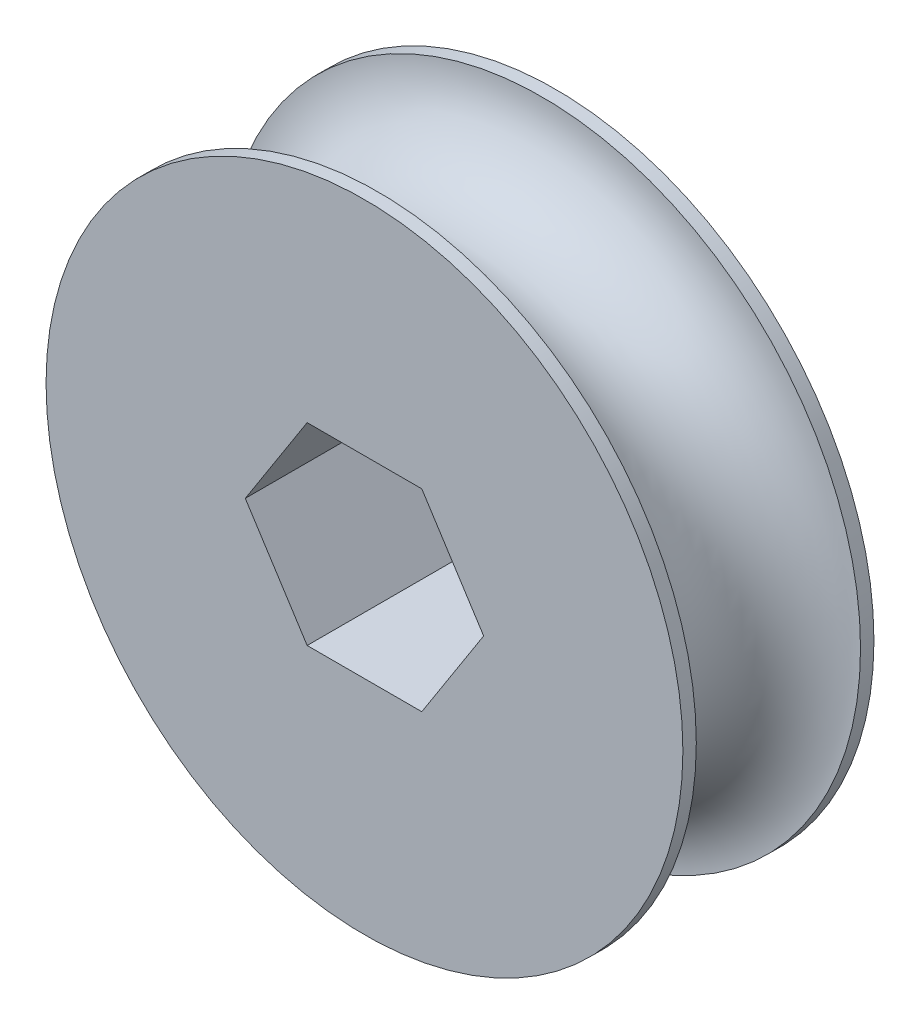
ISO-10303-21;
HEADER;
FILE_DESCRIPTION(('STEP AP214'),'2;1');
FILE_NAME('part.step','',(''),(''),'','','');
FILE_SCHEMA(('AUTOMOTIVE_DESIGN { 1 0 10303 214 1 1 1 1 }'));
ENDSEC;
DATA;
#1=APPLICATION_CONTEXT('core data for automotive mechanical design processes');
#2=APPLICATION_PROTOCOL_DEFINITION('international standard','automotive_design',2000,#1);
#3=PRODUCT_CONTEXT('',#1,'mechanical');
#4=PRODUCT('Part','Part','',(#3));
#5=PRODUCT_RELATED_PRODUCT_CATEGORY('part','',(#4));
#6=PRODUCT_DEFINITION_FORMATION('','',#4);
#7=PRODUCT_DEFINITION_CONTEXT('part definition',#1,'design');
#8=PRODUCT_DEFINITION('design','',#6,#7);
#9=PRODUCT_DEFINITION_SHAPE('','',#8);
#10=(LENGTH_UNIT() NAMED_UNIT(*) SI_UNIT(.MILLI.,.METRE.));
#11=(NAMED_UNIT(*) PLANE_ANGLE_UNIT() SI_UNIT($,.RADIAN.));
#12=(NAMED_UNIT(*) SI_UNIT($,.STERADIAN.) SOLID_ANGLE_UNIT());
#13=UNCERTAINTY_MEASURE_WITH_UNIT(LENGTH_MEASURE(1.E-05),#10,'distance_accuracy_value','');
#14=(GEOMETRIC_REPRESENTATION_CONTEXT(3) GLOBAL_UNCERTAINTY_ASSIGNED_CONTEXT((#13)) GLOBAL_UNIT_ASSIGNED_CONTEXT((#10,
#11,#12)) REPRESENTATION_CONTEXT('',''));
#15=CARTESIAN_POINT('',(0.,0.,0.));
#16=DIRECTION('',(0.,0.,1.));
#17=DIRECTION('',(1.,0.,0.));
#18=AXIS2_PLACEMENT_3D('',#15,#16,#17);
#19=CARTESIAN_POINT('',(0.,0.,30.));
#20=DIRECTION('',(0.,0.,-1.));
#21=DIRECTION('',(-1.,0.,0.));
#22=AXIS2_PLACEMENT_3D('',#19,#20,#21);
#23=CYLINDRICAL_SURFACE('',#22,50.);
#24=CARTESIAN_POINT('',(0.,0.,2.10647683479979));
#25=DIRECTION('',(0.,0.,1.));
#26=DIRECTION('',(1.,0.,0.));
#27=AXIS2_PLACEMENT_3D('',#24,#25,#26);
#28=CIRCLE('',#27,50.);
#29=CARTESIAN_POINT('',(50.,0.,2.10647683479979));
#30=VERTEX_POINT('',#29);
#31=EDGE_CURVE('E49',#30,#30,#28,.F.);
#32=ORIENTED_EDGE('',*,*,#31,.T.);
#33=EDGE_LOOP('',(#32));
#34=FACE_BOUND('',#33,.T.);
#35=CARTESIAN_POINT('',(0.,0.,0.));
#36=DIRECTION('',(0.,0.,1.));
#37=DIRECTION('',(1.,0.,0.));
#38=AXIS2_PLACEMENT_3D('',#35,#36,#37);
#39=CIRCLE('',#38,50.);
#40=CARTESIAN_POINT('',(50.,0.,0.));
#41=VERTEX_POINT('',#40);
#42=EDGE_CURVE('E55',#41,#41,#39,.T.);
#43=ORIENTED_EDGE('',*,*,#42,.T.);
#44=EDGE_LOOP('',(#43));
#45=FACE_BOUND('',#44,.T.);
#46=ADVANCED_FACE('F45',(#34,#45),#23,.T.);
#47=CARTESIAN_POINT('',(0.,0.,30.));
#48=DIRECTION('',(0.,0.,1.));
#49=DIRECTION('',(1.,0.,0.));
#50=AXIS2_PLACEMENT_3D('',#47,#48,#49);
#51=PLANE('',#50);
#52=CARTESIAN_POINT('',(0.,0.,30.));
#53=DIRECTION('',(0.,0.,1.));
#54=DIRECTION('',(1.,0.,0.));
#55=AXIS2_PLACEMENT_3D('',#52,#53,#54);
#56=CIRCLE('',#55,50.);
#57=CARTESIAN_POINT('',(50.,0.,30.));
#58=VERTEX_POINT('',#57);
#59=EDGE_CURVE('E11',#58,#58,#56,.T.);
#60=ORIENTED_EDGE('',*,*,#59,.T.);
#61=EDGE_LOOP('',(#60));
#62=FACE_BOUND('',#61,.T.);
#63=DIRECTION('',(0.539685869959561,-0.841866475022015,0.));
#64=VECTOR('',#63,1.);
#65=CARTESIAN_POINT('',(-9.00000000000001,-15.1535965503963,30.));
#66=LINE('',#65,#64);
#67=CARTESIAN_POINT('',(-18.7143456592721,0.,30.));
#68=VERTEX_POINT('',#67);
#69=CARTESIAN_POINT('',(-9.00000000000001,-15.1535965503963,30.));
#70=VERTEX_POINT('',#69);
#71=EDGE_CURVE('E110',#68,#70,#66,.T.);
#72=ORIENTED_EDGE('',*,*,#71,.F.);
#73=DIRECTION('',(-0.539685869959562,-0.841866475022014,0.));
#74=VECTOR('',#73,1.);
#75=CARTESIAN_POINT('',(-18.7143456592721,0.,30.));
#76=LINE('',#75,#74);
#77=CARTESIAN_POINT('',(-9.,15.1535965503962,30.));
#78=VERTEX_POINT('',#77);
#79=EDGE_CURVE('E101',#78,#68,#76,.T.);
#80=ORIENTED_EDGE('',*,*,#79,.F.);
#81=DIRECTION('',(-1.,0.,0.));
#82=VECTOR('',#81,1.);
#83=CARTESIAN_POINT('',(-9.,15.1535965503962,30.));
#84=LINE('',#83,#82);
#85=CARTESIAN_POINT('',(9.,15.1535965503963,30.));
#86=VERTEX_POINT('',#85);
#87=EDGE_CURVE('E136',#86,#78,#84,.T.);
#88=ORIENTED_EDGE('',*,*,#87,.F.);
#89=DIRECTION('',(-0.539685869959561,0.841866475022014,0.));
#90=VECTOR('',#89,1.);
#91=CARTESIAN_POINT('',(9.,15.1535965503963,30.));
#92=LINE('',#91,#90);
#93=CARTESIAN_POINT('',(18.7143456592721,0.,30.));
#94=VERTEX_POINT('',#93);
#95=EDGE_CURVE('E133',#94,#86,#92,.T.);
#96=ORIENTED_EDGE('',*,*,#95,.F.);
#97=DIRECTION('',(0.539685869959561,0.841866475022015,0.));
#98=VECTOR('',#97,1.);
#99=CARTESIAN_POINT('',(18.7143456592721,0.,30.));
#100=LINE('',#99,#98);
#101=CARTESIAN_POINT('',(9.,-15.1535965503963,30.));
#102=VERTEX_POINT('',#101);
#103=EDGE_CURVE('E128',#102,#94,#100,.T.);
#104=ORIENTED_EDGE('',*,*,#103,.F.);
#105=DIRECTION('',(1.,0.,0.));
#106=VECTOR('',#105,1.);
#107=CARTESIAN_POINT('',(9.,-15.1535965503963,30.));
#108=LINE('',#107,#106);
#109=EDGE_CURVE('E124',#70,#102,#108,.T.);
#110=ORIENTED_EDGE('',*,*,#109,.F.);
#111=EDGE_LOOP('',(#72,#80,#88,#96,#104,#110));
#112=FACE_BOUND('',#111,.T.);
#113=ADVANCED_FACE('F122',(#62,#112),#51,.T.);
#114=CARTESIAN_POINT('',(0.,0.,0.));
#115=DIRECTION('',(0.,0.,1.));
#116=DIRECTION('',(1.,0.,0.));
#117=AXIS2_PLACEMENT_3D('',#114,#115,#116);
#118=PLANE('',#117);
#119=ORIENTED_EDGE('',*,*,#42,.F.);
#120=EDGE_LOOP('',(#119));
#121=FACE_BOUND('',#120,.T.);
#122=DIRECTION('',(-0.539685869959562,-0.841866475022014,0.));
#123=VECTOR('',#122,1.);
#124=CARTESIAN_POINT('',(-18.7143456592721,0.,0.));
#125=LINE('',#124,#123);
#126=CARTESIAN_POINT('',(-9.,15.1535965503962,0.));
#127=VERTEX_POINT('',#126);
#128=CARTESIAN_POINT('',(-18.7143456592721,0.,0.));
#129=VERTEX_POINT('',#128);
#130=EDGE_CURVE('E71',#127,#129,#125,.T.);
#131=ORIENTED_EDGE('',*,*,#130,.T.);
#132=DIRECTION('',(0.539685869959561,-0.841866475022015,0.));
#133=VECTOR('',#132,1.);
#134=CARTESIAN_POINT('',(-9.00000000000001,-15.1535965503963,0.));
#135=LINE('',#134,#133);
#136=CARTESIAN_POINT('',(-9.00000000000001,-15.1535965503963,0.));
#137=VERTEX_POINT('',#136);
#138=EDGE_CURVE('E117',#129,#137,#135,.T.);
#139=ORIENTED_EDGE('',*,*,#138,.T.);
#140=DIRECTION('',(1.,0.,0.));
#141=VECTOR('',#140,1.);
#142=CARTESIAN_POINT('',(9.,-15.1535965503963,0.));
#143=LINE('',#142,#141);
#144=CARTESIAN_POINT('',(9.,-15.1535965503963,0.));
#145=VERTEX_POINT('',#144);
#146=EDGE_CURVE('E143',#137,#145,#143,.T.);
#147=ORIENTED_EDGE('',*,*,#146,.T.);
#148=DIRECTION('',(0.539685869959561,0.841866475022015,0.));
#149=VECTOR('',#148,1.);
#150=CARTESIAN_POINT('',(18.7143456592721,0.,0.));
#151=LINE('',#150,#149);
#152=CARTESIAN_POINT('',(18.7143456592721,0.,0.));
#153=VERTEX_POINT('',#152);
#154=EDGE_CURVE('E147',#145,#153,#151,.T.);
#155=ORIENTED_EDGE('',*,*,#154,.T.);
#156=DIRECTION('',(-0.539685869959561,0.841866475022014,0.));
#157=VECTOR('',#156,1.);
#158=CARTESIAN_POINT('',(9.,15.1535965503963,0.));
#159=LINE('',#158,#157);
#160=CARTESIAN_POINT('',(9.,15.1535965503963,0.));
#161=VERTEX_POINT('',#160);
#162=EDGE_CURVE('E151',#153,#161,#159,.T.);
#163=ORIENTED_EDGE('',*,*,#162,.T.);
#164=DIRECTION('',(-1.,0.,0.));
#165=VECTOR('',#164,1.);
#166=CARTESIAN_POINT('',(-9.,15.1535965503962,0.));
#167=LINE('',#166,#165);
#168=EDGE_CURVE('E111',#161,#127,#167,.T.);
#169=ORIENTED_EDGE('',*,*,#168,.T.);
#170=EDGE_LOOP('',(#131,#139,#147,#155,#163,#169));
#171=FACE_BOUND('',#170,.T.);
#172=ADVANCED_FACE('F198',(#121,#171),#118,.F.);
#173=CARTESIAN_POINT('',(0.,0.,27.8935231652002));
#174=DIRECTION('',(0.,0.,-1.));
#175=DIRECTION('',(-1.,0.,0.));
#176=AXIS2_PLACEMENT_3D('',#173,#174,#175);
#177=CIRCLE('',#176,50.);
#178=CARTESIAN_POINT('',(-50.,0.,27.8935231652002));
#179=VERTEX_POINT('',#178);
#180=EDGE_CURVE('E172',#179,#179,#177,.F.);
#181=ORIENTED_EDGE('',*,*,#180,.T.);
#182=EDGE_LOOP('',(#181));
#183=FACE_BOUND('',#182,.T.);
#184=ORIENTED_EDGE('',*,*,#59,.F.);
#185=EDGE_LOOP('',(#184));
#186=FACE_BOUND('',#185,.T.);
#187=ADVANCED_FACE('F47',(#183,#186),#23,.T.);
#188=CARTESIAN_POINT('',(-18.7143456592721,0.,30.));
#189=DIRECTION('',(0.841866475022014,-0.539685869959562,0.));
#190=DIRECTION('',(0.539685869959562,0.841866475022014,0.));
#191=AXIS2_PLACEMENT_3D('',#188,#189,#190);
#192=PLANE('',#191);
#193=ORIENTED_EDGE('',*,*,#130,.F.);
#194=DIRECTION('',(0.,0.,-1.));
#195=VECTOR('',#194,1.);
#196=CARTESIAN_POINT('',(-9.,15.1535965503962,30.));
#197=LINE('',#196,#195);
#198=EDGE_CURVE('E105',#78,#127,#197,.T.);
#199=ORIENTED_EDGE('',*,*,#198,.F.);
#200=ORIENTED_EDGE('',*,*,#79,.T.);
#201=DIRECTION('',(0.,0.,-1.));
#202=VECTOR('',#201,1.);
#203=CARTESIAN_POINT('',(-18.7143456592721,0.,30.));
#204=LINE('',#203,#202);
#205=EDGE_CURVE('E104',#68,#129,#204,.T.);
#206=ORIENTED_EDGE('',*,*,#205,.T.);
#207=EDGE_LOOP('',(#193,#199,#200,#206));
#208=FACE_BOUND('',#207,.T.);
#209=ADVANCED_FACE('F103',(#208),#192,.T.);
#210=CARTESIAN_POINT('',(-9.00000000000001,-15.1535965503963,30.));
#211=DIRECTION('',(0.841866475022015,0.539685869959561,0.));
#212=DIRECTION('',(-0.539685869959561,0.841866475022015,0.));
#213=AXIS2_PLACEMENT_3D('',#210,#211,#212);
#214=PLANE('',#213);
#215=ORIENTED_EDGE('',*,*,#138,.F.);
#216=ORIENTED_EDGE('',*,*,#205,.F.);
#217=ORIENTED_EDGE('',*,*,#71,.T.);
#218=DIRECTION('',(0.,0.,-1.));
#219=VECTOR('',#218,1.);
#220=CARTESIAN_POINT('',(-9.00000000000001,-15.1535965503963,30.));
#221=LINE('',#220,#219);
#222=EDGE_CURVE('E119',#70,#137,#221,.T.);
#223=ORIENTED_EDGE('',*,*,#222,.T.);
#224=EDGE_LOOP('',(#215,#216,#217,#223));
#225=FACE_BOUND('',#224,.T.);
#226=ADVANCED_FACE('F114',(#225),#214,.T.);
#227=CARTESIAN_POINT('',(9.,-15.1535965503963,30.));
#228=DIRECTION('',(0.,1.,0.));
#229=DIRECTION('',(0.,0.,1.));
#230=AXIS2_PLACEMENT_3D('',#227,#228,#229);
#231=PLANE('',#230);
#232=ORIENTED_EDGE('',*,*,#146,.F.);
#233=ORIENTED_EDGE('',*,*,#222,.F.);
#234=ORIENTED_EDGE('',*,*,#109,.T.);
#235=DIRECTION('',(0.,0.,-1.));
#236=VECTOR('',#235,1.);
#237=CARTESIAN_POINT('',(9.,-15.1535965503963,30.));
#238=LINE('',#237,#236);
#239=EDGE_CURVE('E165',#102,#145,#238,.T.);
#240=ORIENTED_EDGE('',*,*,#239,.T.);
#241=EDGE_LOOP('',(#232,#233,#234,#240));
#242=FACE_BOUND('',#241,.T.);
#243=ADVANCED_FACE('F216',(#242),#231,.T.);
#244=CARTESIAN_POINT('',(18.7143456592721,0.,30.));
#245=DIRECTION('',(-0.841866475022015,0.539685869959561,0.));
#246=DIRECTION('',(-0.539685869959561,-0.841866475022015,0.));
#247=AXIS2_PLACEMENT_3D('',#244,#245,#246);
#248=PLANE('',#247);
#249=ORIENTED_EDGE('',*,*,#154,.F.);
#250=ORIENTED_EDGE('',*,*,#239,.F.);
#251=ORIENTED_EDGE('',*,*,#103,.T.);
#252=DIRECTION('',(0.,0.,-1.));
#253=VECTOR('',#252,1.);
#254=CARTESIAN_POINT('',(18.7143456592721,0.,30.));
#255=LINE('',#254,#253);
#256=EDGE_CURVE('E162',#94,#153,#255,.T.);
#257=ORIENTED_EDGE('',*,*,#256,.T.);
#258=EDGE_LOOP('',(#249,#250,#251,#257));
#259=FACE_BOUND('',#258,.T.);
#260=ADVANCED_FACE('F219',(#259),#248,.T.);
#261=CARTESIAN_POINT('',(9.,15.1535965503963,30.));
#262=DIRECTION('',(-0.841866475022014,-0.539685869959561,0.));
#263=DIRECTION('',(0.539685869959561,-0.841866475022014,0.));
#264=AXIS2_PLACEMENT_3D('',#261,#262,#263);
#265=PLANE('',#264);
#266=ORIENTED_EDGE('',*,*,#162,.F.);
#267=ORIENTED_EDGE('',*,*,#256,.F.);
#268=ORIENTED_EDGE('',*,*,#95,.T.);
#269=DIRECTION('',(0.,0.,-1.));
#270=VECTOR('',#269,1.);
#271=CARTESIAN_POINT('',(9.,15.1535965503963,30.));
#272=LINE('',#271,#270);
#273=EDGE_CURVE('E63',#86,#161,#272,.T.);
#274=ORIENTED_EDGE('',*,*,#273,.T.);
#275=EDGE_LOOP('',(#266,#267,#268,#274));
#276=FACE_BOUND('',#275,.T.);
#277=ADVANCED_FACE('F192',(#276),#265,.T.);
#278=CARTESIAN_POINT('',(-9.,15.1535965503962,30.));
#279=DIRECTION('',(0.,-1.,0.));
#280=DIRECTION('',(1.,0.,0.));
#281=AXIS2_PLACEMENT_3D('',#278,#279,#280);
#282=PLANE('',#281);
#283=ORIENTED_EDGE('',*,*,#168,.F.);
#284=ORIENTED_EDGE('',*,*,#273,.F.);
#285=ORIENTED_EDGE('',*,*,#87,.T.);
#286=ORIENTED_EDGE('',*,*,#198,.T.);
#287=EDGE_LOOP('',(#283,#284,#285,#286));
#288=FACE_BOUND('',#287,.T.);
#289=ADVANCED_FACE('F185',(#288),#282,.T.);
#290=CARTESIAN_POINT('',(0.,0.,15.));
#291=DIRECTION('',(0.,0.,-1.));
#292=DIRECTION('',(-1.,0.,0.));
#293=AXIS2_PLACEMENT_3D('',#290,#291,#292);
#294=TOROIDAL_SURFACE('',#293,50.,12.8935231652002);
#295=ORIENTED_EDGE('',*,*,#180,.F.);
#296=EDGE_LOOP('',(#295));
#297=FACE_BOUND('',#296,.T.);
#298=ORIENTED_EDGE('',*,*,#31,.F.);
#299=EDGE_LOOP('',(#298));
#300=FACE_BOUND('',#299,.T.);
#301=ADVANCED_FACE('F183',(#297,#300),#294,.F.);
#302=CLOSED_SHELL('',(#46,#113,#172,#187,#209,#226,#243,#260,#277,#289,#301));
#303=MANIFOLD_SOLID_BREP('B2',#302);
#304=ADVANCED_BREP_SHAPE_REPRESENTATION('',(#18,#303),#14);
#305=SHAPE_DEFINITION_REPRESENTATION(#9,#304);
ENDSEC;
END-ISO-10303-21;
